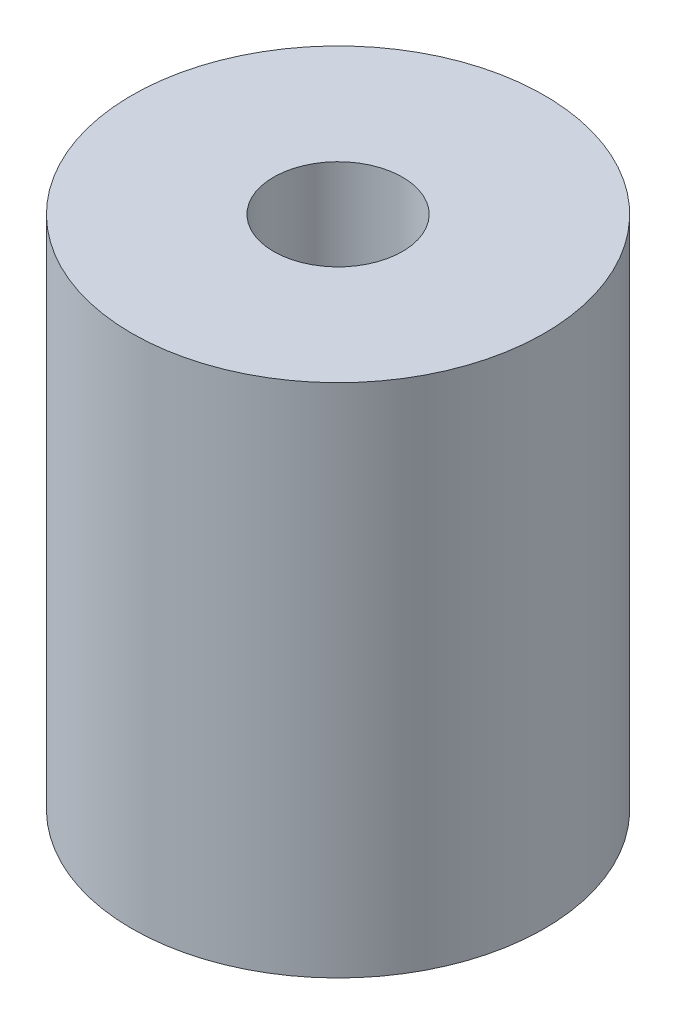
ISO-10303-21;
HEADER;
FILE_DESCRIPTION(('STEP AP214'),'2;1');
FILE_NAME('part.step','',(''),(''),'','','');
FILE_SCHEMA(('AUTOMOTIVE_DESIGN { 1 0 10303 214 1 1 1 1 }'));
ENDSEC;
DATA;
#1=APPLICATION_CONTEXT('core data for automotive mechanical design processes');
#2=APPLICATION_PROTOCOL_DEFINITION('international standard','automotive_design',2000,#1);
#3=PRODUCT_CONTEXT('',#1,'mechanical');
#4=PRODUCT('Part','Part','',(#3));
#5=PRODUCT_RELATED_PRODUCT_CATEGORY('part','',(#4));
#6=PRODUCT_DEFINITION_FORMATION('','',#4);
#7=PRODUCT_DEFINITION_CONTEXT('part definition',#1,'design');
#8=PRODUCT_DEFINITION('design','',#6,#7);
#9=PRODUCT_DEFINITION_SHAPE('','',#8);
#10=(LENGTH_UNIT() NAMED_UNIT(*) SI_UNIT(.MILLI.,.METRE.));
#11=(NAMED_UNIT(*) PLANE_ANGLE_UNIT() SI_UNIT($,.RADIAN.));
#12=(NAMED_UNIT(*) SI_UNIT($,.STERADIAN.) SOLID_ANGLE_UNIT());
#13=UNCERTAINTY_MEASURE_WITH_UNIT(LENGTH_MEASURE(1.E-05),#10,'distance_accuracy_value','');
#14=(GEOMETRIC_REPRESENTATION_CONTEXT(3) GLOBAL_UNCERTAINTY_ASSIGNED_CONTEXT((#13)) GLOBAL_UNIT_ASSIGNED_CONTEXT((#10,
#11,#12)) REPRESENTATION_CONTEXT('',''));
#15=CARTESIAN_POINT('',(0.,0.,0.));
#16=DIRECTION('',(0.,0.,1.));
#17=DIRECTION('',(1.,0.,0.));
#18=AXIS2_PLACEMENT_3D('',#15,#16,#17);
#19=CARTESIAN_POINT('',(0.,10.,0.));
#20=DIRECTION('',(0.,1.,0.));
#21=DIRECTION('',(0.,0.,1.));
#22=AXIS2_PLACEMENT_3D('',#19,#20,#21);
#23=PLANE('',#22);
#24=CARTESIAN_POINT('',(0.,10.,0.));
#25=DIRECTION('',(0.,1.,0.));
#26=DIRECTION('',(0.,0.,1.));
#27=AXIS2_PLACEMENT_3D('',#24,#25,#26);
#28=CIRCLE('',#27,4.);
#29=CARTESIAN_POINT('',(0.,10.,4.));
#30=VERTEX_POINT('',#29);
#31=EDGE_CURVE('E10',#30,#30,#28,.T.);
#32=ORIENTED_EDGE('',*,*,#31,.T.);
#33=EDGE_LOOP('',(#32));
#34=FACE_BOUND('',#33,.T.);
#35=CARTESIAN_POINT('',(0.,10.,0.));
#36=DIRECTION('',(0.,1.,0.));
#37=DIRECTION('',(0.,0.,1.));
#38=AXIS2_PLACEMENT_3D('',#35,#36,#37);
#39=CIRCLE('',#38,1.25);
#40=CARTESIAN_POINT('',(0.,10.,1.25));
#41=VERTEX_POINT('',#40);
#42=EDGE_CURVE('E43',#41,#41,#39,.T.);
#43=ORIENTED_EDGE('',*,*,#42,.F.);
#44=EDGE_LOOP('',(#43));
#45=FACE_BOUND('',#44,.T.);
#46=ADVANCED_FACE('F32',(#34,#45),#23,.T.);
#47=CARTESIAN_POINT('',(0.,0.,0.));
#48=DIRECTION('',(0.,1.,0.));
#49=DIRECTION('',(0.,0.,1.));
#50=AXIS2_PLACEMENT_3D('',#47,#48,#49);
#51=PLANE('',#50);
#52=CARTESIAN_POINT('',(0.,0.,0.));
#53=DIRECTION('',(0.,1.,0.));
#54=DIRECTION('',(0.,0.,1.));
#55=AXIS2_PLACEMENT_3D('',#52,#53,#54);
#56=CIRCLE('',#55,4.);
#57=CARTESIAN_POINT('',(0.,0.,4.));
#58=VERTEX_POINT('',#57);
#59=EDGE_CURVE('E36',#58,#58,#56,.T.);
#60=ORIENTED_EDGE('',*,*,#59,.F.);
#61=EDGE_LOOP('',(#60));
#62=FACE_BOUND('',#61,.T.);
#63=CARTESIAN_POINT('',(0.,0.,0.));
#64=DIRECTION('',(0.,1.,0.));
#65=DIRECTION('',(0.,0.,1.));
#66=AXIS2_PLACEMENT_3D('',#63,#64,#65);
#67=CIRCLE('',#66,1.25);
#68=CARTESIAN_POINT('',(0.,0.,1.25));
#69=VERTEX_POINT('',#68);
#70=EDGE_CURVE('E45',#69,#69,#67,.T.);
#71=ORIENTED_EDGE('',*,*,#70,.T.);
#72=EDGE_LOOP('',(#71));
#73=FACE_BOUND('',#72,.T.);
#74=ADVANCED_FACE('F55',(#62,#73),#51,.F.);
#75=CARTESIAN_POINT('',(0.,10.,0.));
#76=DIRECTION('',(0.,-1.,0.));
#77=DIRECTION('',(0.,0.,-1.));
#78=AXIS2_PLACEMENT_3D('',#75,#76,#77);
#79=CYLINDRICAL_SURFACE('',#78,4.);
#80=ORIENTED_EDGE('',*,*,#31,.F.);
#81=EDGE_LOOP('',(#80));
#82=FACE_BOUND('',#81,.T.);
#83=ORIENTED_EDGE('',*,*,#59,.T.);
#84=EDGE_LOOP('',(#83));
#85=FACE_BOUND('',#84,.T.);
#86=ADVANCED_FACE('F34',(#82,#85),#79,.T.);
#87=CARTESIAN_POINT('',(0.,10.,0.));
#88=DIRECTION('',(0.,-1.,0.));
#89=DIRECTION('',(0.,0.,-1.));
#90=AXIS2_PLACEMENT_3D('',#87,#88,#89);
#91=CYLINDRICAL_SURFACE('',#90,1.25);
#92=ORIENTED_EDGE('',*,*,#42,.T.);
#93=EDGE_LOOP('',(#92));
#94=FACE_BOUND('',#93,.T.);
#95=ORIENTED_EDGE('',*,*,#70,.F.);
#96=EDGE_LOOP('',(#95));
#97=FACE_BOUND('',#96,.T.);
#98=ADVANCED_FACE('F51',(#94,#97),#91,.F.);
#99=CLOSED_SHELL('',(#46,#74,#86,#98));
#100=MANIFOLD_SOLID_BREP('B2',#99);
#101=ADVANCED_BREP_SHAPE_REPRESENTATION('',(#18,#100),#14);
#102=SHAPE_DEFINITION_REPRESENTATION(#9,#101);
ENDSEC;
END-ISO-10303-21;
